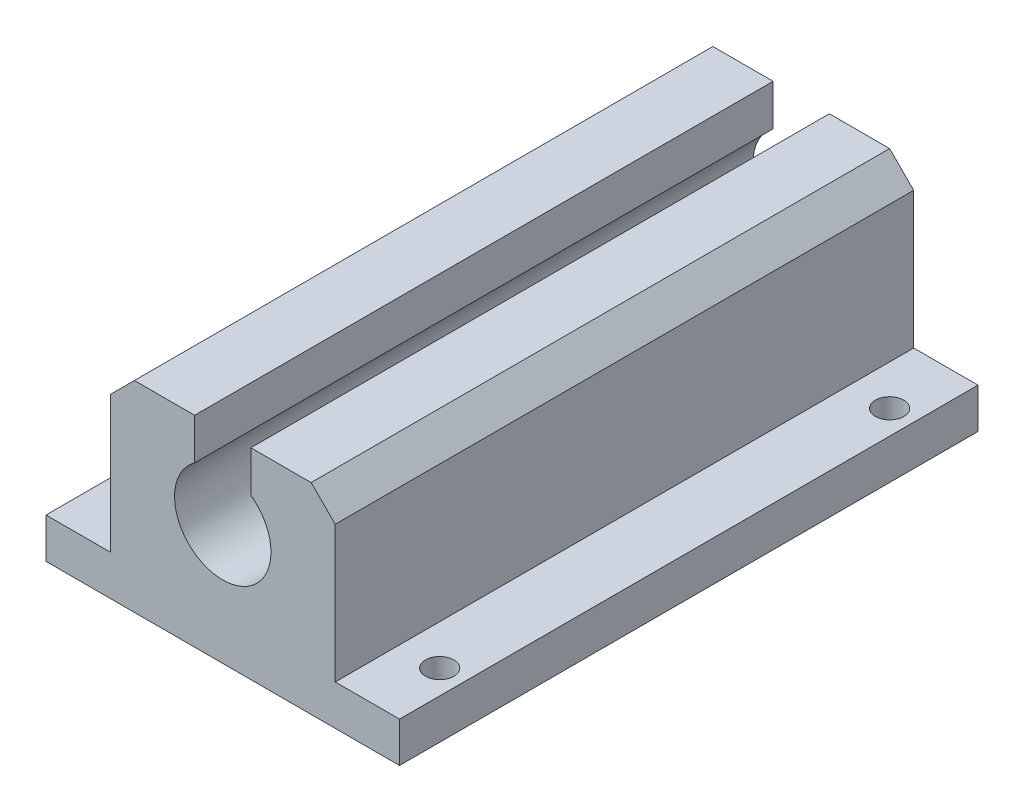
ISO-10303-21;
HEADER;
FILE_DESCRIPTION(('STEP AP214'),'2;1');
FILE_NAME('part.step','',(''),(''),'','','');
FILE_SCHEMA(('AUTOMOTIVE_DESIGN { 1 0 10303 214 1 1 1 1 }'));
ENDSEC;
DATA;
#1=APPLICATION_CONTEXT('core data for automotive mechanical design processes');
#2=APPLICATION_PROTOCOL_DEFINITION('international standard','automotive_design',2000,#1);
#3=PRODUCT_CONTEXT('',#1,'mechanical');
#4=PRODUCT('Part','Part','',(#3));
#5=PRODUCT_RELATED_PRODUCT_CATEGORY('part','',(#4));
#6=PRODUCT_DEFINITION_FORMATION('','',#4);
#7=PRODUCT_DEFINITION_CONTEXT('part definition',#1,'design');
#8=PRODUCT_DEFINITION('design','',#6,#7);
#9=PRODUCT_DEFINITION_SHAPE('','',#8);
#10=(LENGTH_UNIT() NAMED_UNIT(*) SI_UNIT(.MILLI.,.METRE.));
#11=(NAMED_UNIT(*) PLANE_ANGLE_UNIT() SI_UNIT($,.RADIAN.));
#12=(NAMED_UNIT(*) SI_UNIT($,.STERADIAN.) SOLID_ANGLE_UNIT());
#13=UNCERTAINTY_MEASURE_WITH_UNIT(LENGTH_MEASURE(1.E-05),#10,'distance_accuracy_value','');
#14=(GEOMETRIC_REPRESENTATION_CONTEXT(3) GLOBAL_UNCERTAINTY_ASSIGNED_CONTEXT((#13)) GLOBAL_UNIT_ASSIGNED_CONTEXT((#10,
#11,#12)) REPRESENTATION_CONTEXT('',''));
#15=CARTESIAN_POINT('',(0.,0.,0.));
#16=DIRECTION('',(0.,0.,1.));
#17=DIRECTION('',(1.,0.,0.));
#18=AXIS2_PLACEMENT_3D('',#15,#16,#17);
#19=CARTESIAN_POINT('',(34.925,-23.8125,57.15));
#20=DIRECTION('',(0.,1.,0.));
#21=DIRECTION('',(0.,0.,1.));
#22=AXIS2_PLACEMENT_3D('',#19,#20,#21);
#23=PLANE('',#22);
#24=CARTESIAN_POINT('',(-30.1625,-23.8125,-44.45));
#25=DIRECTION('',(0.,-1.,0.));
#26=DIRECTION('',(0.,0.,-1.));
#27=AXIS2_PLACEMENT_3D('',#24,#25,#26);
#28=CIRCLE('',#27,2.8067);
#29=CARTESIAN_POINT('',(-30.1625,-23.8125,-47.2567));
#30=VERTEX_POINT('',#29);
#31=EDGE_CURVE('E305',#30,#30,#28,.T.);
#32=ORIENTED_EDGE('',*,*,#31,.F.);
#33=EDGE_LOOP('',(#32));
#34=FACE_BOUND('',#33,.T.);
#35=CARTESIAN_POINT('',(30.1625,-23.8125,-44.45));
#36=DIRECTION('',(0.,-1.,0.));
#37=DIRECTION('',(0.,0.,-1.));
#38=AXIS2_PLACEMENT_3D('',#35,#36,#37);
#39=CIRCLE('',#38,2.8067);
#40=CARTESIAN_POINT('',(30.1625,-23.8125,-47.2567));
#41=VERTEX_POINT('',#40);
#42=EDGE_CURVE('E299',#41,#41,#39,.T.);
#43=ORIENTED_EDGE('',*,*,#42,.F.);
#44=EDGE_LOOP('',(#43));
#45=FACE_BOUND('',#44,.T.);
#46=DIRECTION('',(1.,0.,0.));
#47=VECTOR('',#46,1.);
#48=CARTESIAN_POINT('',(34.925,-23.8125,-57.15));
#49=LINE('',#48,#47);
#50=CARTESIAN_POINT('',(-34.925,-23.8125,-57.15));
#51=VERTEX_POINT('',#50);
#52=CARTESIAN_POINT('',(34.925,-23.8125,-57.15));
#53=VERTEX_POINT('',#52);
#54=EDGE_CURVE('E189',#51,#53,#49,.T.);
#55=ORIENTED_EDGE('',*,*,#54,.T.);
#56=DIRECTION('',(0.,0.,-1.));
#57=VECTOR('',#56,1.);
#58=CARTESIAN_POINT('',(34.925,-23.8125,57.15));
#59=LINE('',#58,#57);
#60=CARTESIAN_POINT('',(34.925,-23.8125,57.15));
#61=VERTEX_POINT('',#60);
#62=EDGE_CURVE('E225',#61,#53,#59,.T.);
#63=ORIENTED_EDGE('',*,*,#62,.F.);
#64=DIRECTION('',(1.,0.,0.));
#65=VECTOR('',#64,1.);
#66=CARTESIAN_POINT('',(34.925,-23.8125,57.15));
#67=LINE('',#66,#65);
#68=CARTESIAN_POINT('',(-34.925,-23.8125,57.15));
#69=VERTEX_POINT('',#68);
#70=EDGE_CURVE('E213',#69,#61,#67,.T.);
#71=ORIENTED_EDGE('',*,*,#70,.F.);
#72=DIRECTION('',(0.,0.,-1.));
#73=VECTOR('',#72,1.);
#74=CARTESIAN_POINT('',(-34.925,-23.8125,57.15));
#75=LINE('',#74,#73);
#76=EDGE_CURVE('E228',#69,#51,#75,.T.);
#77=ORIENTED_EDGE('',*,*,#76,.T.);
#78=EDGE_LOOP('',(#55,#63,#71,#77));
#79=FACE_BOUND('',#78,.T.);
#80=CARTESIAN_POINT('',(30.1625,-23.8125,44.45));
#81=DIRECTION('',(0.,-1.,0.));
#82=DIRECTION('',(0.,0.,-1.));
#83=AXIS2_PLACEMENT_3D('',#80,#81,#82);
#84=CIRCLE('',#83,2.8067);
#85=CARTESIAN_POINT('',(30.1625,-23.8125,41.6433));
#86=VERTEX_POINT('',#85);
#87=EDGE_CURVE('E285',#86,#86,#84,.T.);
#88=ORIENTED_EDGE('',*,*,#87,.F.);
#89=EDGE_LOOP('',(#88));
#90=FACE_BOUND('',#89,.T.);
#91=CARTESIAN_POINT('',(-30.1625,-23.8125,44.45));
#92=DIRECTION('',(0.,-1.,0.));
#93=DIRECTION('',(0.,0.,-1.));
#94=AXIS2_PLACEMENT_3D('',#91,#92,#93);
#95=CIRCLE('',#94,2.8067);
#96=CARTESIAN_POINT('',(-30.1625,-23.8125,41.6433));
#97=VERTEX_POINT('',#96);
#98=EDGE_CURVE('E293',#97,#97,#95,.T.);
#99=ORIENTED_EDGE('',*,*,#98,.F.);
#100=EDGE_LOOP('',(#99));
#101=FACE_BOUND('',#100,.T.);
#102=ADVANCED_FACE('F48',(#34,#45,#79,#90,#101),#23,.F.);
#103=CARTESIAN_POINT('',(22.225,15.875,57.15));
#104=DIRECTION('',(-1.,0.,0.));
#105=DIRECTION('',(0.,0.,1.));
#106=AXIS2_PLACEMENT_3D('',#103,#104,#105);
#107=PLANE('',#106);
#108=DIRECTION('',(0.,1.,0.));
#109=VECTOR('',#108,1.);
#110=CARTESIAN_POINT('',(22.225,15.875,-57.15));
#111=LINE('',#110,#109);
#112=CARTESIAN_POINT('',(22.225,-15.875,-57.15));
#113=VERTEX_POINT('',#112);
#114=CARTESIAN_POINT('',(22.225,11.1125,-57.15));
#115=VERTEX_POINT('',#114);
#116=EDGE_CURVE('E159',#113,#115,#111,.T.);
#117=ORIENTED_EDGE('',*,*,#116,.T.);
#118=DIRECTION('',(0.,0.,1.));
#119=VECTOR('',#118,1.);
#120=CARTESIAN_POINT('',(22.225,11.1125,57.15));
#121=LINE('',#120,#119);
#122=CARTESIAN_POINT('',(22.225,11.1125,57.15));
#123=VERTEX_POINT('',#122);
#124=EDGE_CURVE('E13',#115,#123,#121,.T.);
#125=ORIENTED_EDGE('',*,*,#124,.T.);
#126=DIRECTION('',(0.,1.,0.));
#127=VECTOR('',#126,1.);
#128=CARTESIAN_POINT('',(22.225,15.875,57.15));
#129=LINE('',#128,#127);
#130=CARTESIAN_POINT('',(22.225,-15.875,57.15));
#131=VERTEX_POINT('',#130);
#132=EDGE_CURVE('E195',#131,#123,#129,.T.);
#133=ORIENTED_EDGE('',*,*,#132,.F.);
#134=DIRECTION('',(0.,0.,-1.));
#135=VECTOR('',#134,1.);
#136=CARTESIAN_POINT('',(22.225,-15.875,57.15));
#137=LINE('',#136,#135);
#138=EDGE_CURVE('E219',#131,#113,#137,.T.);
#139=ORIENTED_EDGE('',*,*,#138,.T.);
#140=EDGE_LOOP('',(#117,#125,#133,#139));
#141=FACE_BOUND('',#140,.T.);
#142=ADVANCED_FACE('F50',(#141),#107,.F.);
#143=CARTESIAN_POINT('',(22.225,15.875,57.15));
#144=DIRECTION('',(0.,-1.,0.));
#145=DIRECTION('',(0.,0.,-1.));
#146=AXIS2_PLACEMENT_3D('',#143,#144,#145);
#147=PLANE('',#146);
#148=DIRECTION('',(-1.,0.,0.));
#149=VECTOR('',#148,1.);
#150=CARTESIAN_POINT('',(22.225,15.875,57.15));
#151=LINE('',#150,#149);
#152=CARTESIAN_POINT('',(17.4625,15.875,57.15));
#153=VERTEX_POINT('',#152);
#154=CARTESIAN_POINT('',(5.55625,15.875,57.15));
#155=VERTEX_POINT('',#154);
#156=EDGE_CURVE('E197',#153,#155,#151,.T.);
#157=ORIENTED_EDGE('',*,*,#156,.F.);
#158=DIRECTION('',(0.,0.,-1.));
#159=VECTOR('',#158,1.);
#160=CARTESIAN_POINT('',(17.4625,15.875,57.15));
#161=LINE('',#160,#159);
#162=CARTESIAN_POINT('',(17.4625,15.875,-57.15));
#163=VERTEX_POINT('',#162);
#164=EDGE_CURVE('E56',#153,#163,#161,.T.);
#165=ORIENTED_EDGE('',*,*,#164,.T.);
#166=DIRECTION('',(-1.,0.,0.));
#167=VECTOR('',#166,1.);
#168=CARTESIAN_POINT('',(22.225,15.875,-57.15));
#169=LINE('',#168,#167);
#170=CARTESIAN_POINT('',(5.55625,15.875,-57.15));
#171=VERTEX_POINT('',#170);
#172=EDGE_CURVE('E150',#163,#171,#169,.T.);
#173=ORIENTED_EDGE('',*,*,#172,.T.);
#174=DIRECTION('',(0.,0.,-1.));
#175=VECTOR('',#174,1.);
#176=CARTESIAN_POINT('',(5.55625,15.875,57.15));
#177=LINE('',#176,#175);
#178=EDGE_CURVE('E153',#155,#171,#177,.T.);
#179=ORIENTED_EDGE('',*,*,#178,.F.);
#180=EDGE_LOOP('',(#157,#165,#173,#179));
#181=FACE_BOUND('',#180,.T.);
#182=ADVANCED_FACE('F152',(#181),#147,.F.);
#183=CARTESIAN_POINT('',(5.55625,15.875,57.15));
#184=DIRECTION('',(1.,0.,0.));
#185=DIRECTION('',(0.,0.,-1.));
#186=AXIS2_PLACEMENT_3D('',#183,#184,#185);
#187=PLANE('',#186);
#188=DIRECTION('',(0.,-1.,0.));
#189=VECTOR('',#188,1.);
#190=CARTESIAN_POINT('',(5.55625,15.875,-57.15));
#191=LINE('',#190,#189);
#192=CARTESIAN_POINT('',(5.55625,7.73651801119212,-57.15));
#193=VERTEX_POINT('',#192);
#194=EDGE_CURVE('E158',#171,#193,#191,.T.);
#195=ORIENTED_EDGE('',*,*,#194,.T.);
#196=DIRECTION('',(0.,0.,-1.));
#197=VECTOR('',#196,1.);
#198=CARTESIAN_POINT('',(5.55625,7.73651801119212,57.15));
#199=LINE('',#198,#197);
#200=CARTESIAN_POINT('',(5.55625,7.73651801119212,57.15));
#201=VERTEX_POINT('',#200);
#202=EDGE_CURVE('E167',#201,#193,#199,.T.);
#203=ORIENTED_EDGE('',*,*,#202,.F.);
#204=DIRECTION('',(0.,-1.,0.));
#205=VECTOR('',#204,1.);
#206=CARTESIAN_POINT('',(5.55625,15.875,57.15));
#207=LINE('',#206,#205);
#208=EDGE_CURVE('E165',#155,#201,#207,.T.);
#209=ORIENTED_EDGE('',*,*,#208,.F.);
#210=ORIENTED_EDGE('',*,*,#178,.T.);
#211=EDGE_LOOP('',(#195,#203,#209,#210));
#212=FACE_BOUND('',#211,.T.);
#213=ADVANCED_FACE('F162',(#212),#187,.F.);
#214=CARTESIAN_POINT('',(0.,0.,57.15));
#215=DIRECTION('',(0.,0.,-1.));
#216=DIRECTION('',(-1.,0.,0.));
#217=AXIS2_PLACEMENT_3D('',#214,#215,#216);
#218=CYLINDRICAL_SURFACE('',#217,9.525);
#219=CARTESIAN_POINT('',(0.,0.,-57.15));
#220=DIRECTION('',(0.,0.,-1.));
#221=DIRECTION('',(1.,0.,0.));
#222=AXIS2_PLACEMENT_3D('',#219,#220,#221);
#223=CIRCLE('',#222,9.525);
#224=CARTESIAN_POINT('',(-5.55625,7.73651801119212,-57.15));
#225=VERTEX_POINT('',#224);
#226=EDGE_CURVE('E173',#193,#225,#223,.T.);
#227=ORIENTED_EDGE('',*,*,#226,.T.);
#228=DIRECTION('',(0.,0.,-1.));
#229=VECTOR('',#228,1.);
#230=CARTESIAN_POINT('',(-5.55625,7.73651801119212,57.15));
#231=LINE('',#230,#229);
#232=CARTESIAN_POINT('',(-5.55625,7.73651801119212,57.15));
#233=VERTEX_POINT('',#232);
#234=EDGE_CURVE('E240',#233,#225,#231,.T.);
#235=ORIENTED_EDGE('',*,*,#234,.F.);
#236=CARTESIAN_POINT('',(0.,0.,57.15));
#237=DIRECTION('',(0.,0.,-1.));
#238=DIRECTION('',(1.,0.,0.));
#239=AXIS2_PLACEMENT_3D('',#236,#237,#238);
#240=CIRCLE('',#239,9.525);
#241=EDGE_CURVE('E200',#201,#233,#240,.T.);
#242=ORIENTED_EDGE('',*,*,#241,.F.);
#243=ORIENTED_EDGE('',*,*,#202,.T.);
#244=EDGE_LOOP('',(#227,#235,#242,#243));
#245=FACE_BOUND('',#244,.T.);
#246=ADVANCED_FACE('F277',(#245),#218,.F.);
#247=CARTESIAN_POINT('',(-5.55625,15.875,57.15));
#248=DIRECTION('',(-1.,0.,0.));
#249=DIRECTION('',(0.,0.,1.));
#250=AXIS2_PLACEMENT_3D('',#247,#248,#249);
#251=PLANE('',#250);
#252=DIRECTION('',(0.,1.,0.));
#253=VECTOR('',#252,1.);
#254=CARTESIAN_POINT('',(-5.55625,15.875,-57.15));
#255=LINE('',#254,#253);
#256=CARTESIAN_POINT('',(-5.55625,15.875,-57.15));
#257=VERTEX_POINT('',#256);
#258=EDGE_CURVE('E175',#225,#257,#255,.T.);
#259=ORIENTED_EDGE('',*,*,#258,.T.);
#260=DIRECTION('',(0.,0.,-1.));
#261=VECTOR('',#260,1.);
#262=CARTESIAN_POINT('',(-5.55625,15.875,57.15));
#263=LINE('',#262,#261);
#264=CARTESIAN_POINT('',(-5.55625,15.875,57.15));
#265=VERTEX_POINT('',#264);
#266=EDGE_CURVE('E237',#265,#257,#263,.T.);
#267=ORIENTED_EDGE('',*,*,#266,.F.);
#268=DIRECTION('',(0.,1.,0.));
#269=VECTOR('',#268,1.);
#270=CARTESIAN_POINT('',(-5.55625,15.875,57.15));
#271=LINE('',#270,#269);
#272=EDGE_CURVE('E202',#233,#265,#271,.T.);
#273=ORIENTED_EDGE('',*,*,#272,.F.);
#274=ORIENTED_EDGE('',*,*,#234,.T.);
#275=EDGE_LOOP('',(#259,#267,#273,#274));
#276=FACE_BOUND('',#275,.T.);
#277=ADVANCED_FACE('F273',(#276),#251,.F.);
#278=CARTESIAN_POINT('',(-22.225,15.875,57.15));
#279=DIRECTION('',(0.,-1.,0.));
#280=DIRECTION('',(0.,0.,-1.));
#281=AXIS2_PLACEMENT_3D('',#278,#279,#280);
#282=PLANE('',#281);
#283=DIRECTION('',(-1.,0.,0.));
#284=VECTOR('',#283,1.);
#285=CARTESIAN_POINT('',(-22.225,15.875,-57.15));
#286=LINE('',#285,#284);
#287=CARTESIAN_POINT('',(-17.4625,15.875,-57.15));
#288=VERTEX_POINT('',#287);
#289=EDGE_CURVE('E180',#257,#288,#286,.T.);
#290=ORIENTED_EDGE('',*,*,#289,.T.);
#291=DIRECTION('',(0.,0.,1.));
#292=VECTOR('',#291,1.);
#293=CARTESIAN_POINT('',(-17.4625,15.875,57.15));
#294=LINE('',#293,#292);
#295=CARTESIAN_POINT('',(-17.4625,15.875,57.15));
#296=VERTEX_POINT('',#295);
#297=EDGE_CURVE('E250',#288,#296,#294,.T.);
#298=ORIENTED_EDGE('',*,*,#297,.T.);
#299=DIRECTION('',(-1.,0.,0.));
#300=VECTOR('',#299,1.);
#301=CARTESIAN_POINT('',(-22.225,15.875,57.15));
#302=LINE('',#301,#300);
#303=EDGE_CURVE('E204',#265,#296,#302,.T.);
#304=ORIENTED_EDGE('',*,*,#303,.F.);
#305=ORIENTED_EDGE('',*,*,#266,.T.);
#306=EDGE_LOOP('',(#290,#298,#304,#305));
#307=FACE_BOUND('',#306,.T.);
#308=ADVANCED_FACE('F269',(#307),#282,.F.);
#309=CARTESIAN_POINT('',(-22.225,-15.875,57.15));
#310=DIRECTION('',(1.,0.,0.));
#311=DIRECTION('',(0.,0.,-1.));
#312=AXIS2_PLACEMENT_3D('',#309,#310,#311);
#313=PLANE('',#312);
#314=DIRECTION('',(0.,-1.,0.));
#315=VECTOR('',#314,1.);
#316=CARTESIAN_POINT('',(-22.225,-15.875,57.15));
#317=LINE('',#316,#315);
#318=CARTESIAN_POINT('',(-22.225,11.1125,57.15));
#319=VERTEX_POINT('',#318);
#320=CARTESIAN_POINT('',(-22.225,-15.875,57.15));
#321=VERTEX_POINT('',#320);
#322=EDGE_CURVE('E207',#319,#321,#317,.T.);
#323=ORIENTED_EDGE('',*,*,#322,.F.);
#324=DIRECTION('',(0.,0.,-1.));
#325=VECTOR('',#324,1.);
#326=CARTESIAN_POINT('',(-22.225,11.1125,57.15));
#327=LINE('',#326,#325);
#328=CARTESIAN_POINT('',(-22.225,11.1125,-57.15));
#329=VERTEX_POINT('',#328);
#330=EDGE_CURVE('E166',#319,#329,#327,.T.);
#331=ORIENTED_EDGE('',*,*,#330,.T.);
#332=DIRECTION('',(0.,-1.,0.));
#333=VECTOR('',#332,1.);
#334=CARTESIAN_POINT('',(-22.225,-15.875,-57.15));
#335=LINE('',#334,#333);
#336=CARTESIAN_POINT('',(-22.225,-15.875,-57.15));
#337=VERTEX_POINT('',#336);
#338=EDGE_CURVE('E183',#329,#337,#335,.T.);
#339=ORIENTED_EDGE('',*,*,#338,.T.);
#340=DIRECTION('',(0.,0.,-1.));
#341=VECTOR('',#340,1.);
#342=CARTESIAN_POINT('',(-22.225,-15.875,57.15));
#343=LINE('',#342,#341);
#344=EDGE_CURVE('E234',#321,#337,#343,.T.);
#345=ORIENTED_EDGE('',*,*,#344,.F.);
#346=EDGE_LOOP('',(#323,#331,#339,#345));
#347=FACE_BOUND('',#346,.T.);
#348=ADVANCED_FACE('F263',(#347),#313,.F.);
#349=CARTESIAN_POINT('',(-34.925,-15.875,57.15));
#350=DIRECTION('',(0.,-1.,0.));
#351=DIRECTION('',(0.,0.,-1.));
#352=AXIS2_PLACEMENT_3D('',#349,#350,#351);
#353=PLANE('',#352);
#354=CARTESIAN_POINT('',(-30.1625,-15.875,-44.45));
#355=DIRECTION('',(0.,-1.,0.));
#356=DIRECTION('',(0.,0.,-1.));
#357=AXIS2_PLACEMENT_3D('',#354,#355,#356);
#358=CIRCLE('',#357,2.8067);
#359=CARTESIAN_POINT('',(-30.1625,-15.875,-47.2567));
#360=VERTEX_POINT('',#359);
#361=EDGE_CURVE('E302',#360,#360,#358,.T.);
#362=ORIENTED_EDGE('',*,*,#361,.T.);
#363=EDGE_LOOP('',(#362));
#364=FACE_BOUND('',#363,.T.);
#365=CARTESIAN_POINT('',(-30.1625,-15.875,44.45));
#366=DIRECTION('',(0.,-1.,0.));
#367=DIRECTION('',(0.,0.,-1.));
#368=AXIS2_PLACEMENT_3D('',#365,#366,#367);
#369=CIRCLE('',#368,2.8067);
#370=CARTESIAN_POINT('',(-30.1625,-15.875,41.6433));
#371=VERTEX_POINT('',#370);
#372=EDGE_CURVE('E290',#371,#371,#369,.T.);
#373=ORIENTED_EDGE('',*,*,#372,.T.);
#374=EDGE_LOOP('',(#373));
#375=FACE_BOUND('',#374,.T.);
#376=DIRECTION('',(-1.,0.,0.));
#377=VECTOR('',#376,1.);
#378=CARTESIAN_POINT('',(-34.925,-15.875,-57.15));
#379=LINE('',#378,#377);
#380=CARTESIAN_POINT('',(-34.925,-15.875,-57.15));
#381=VERTEX_POINT('',#380);
#382=EDGE_CURVE('E185',#337,#381,#379,.T.);
#383=ORIENTED_EDGE('',*,*,#382,.T.);
#384=DIRECTION('',(0.,0.,-1.));
#385=VECTOR('',#384,1.);
#386=CARTESIAN_POINT('',(-34.925,-15.875,57.15));
#387=LINE('',#386,#385);
#388=CARTESIAN_POINT('',(-34.925,-15.875,57.15));
#389=VERTEX_POINT('',#388);
#390=EDGE_CURVE('E231',#389,#381,#387,.T.);
#391=ORIENTED_EDGE('',*,*,#390,.F.);
#392=DIRECTION('',(-1.,0.,0.));
#393=VECTOR('',#392,1.);
#394=CARTESIAN_POINT('',(-34.925,-15.875,57.15));
#395=LINE('',#394,#393);
#396=EDGE_CURVE('E209',#321,#389,#395,.T.);
#397=ORIENTED_EDGE('',*,*,#396,.F.);
#398=ORIENTED_EDGE('',*,*,#344,.T.);
#399=EDGE_LOOP('',(#383,#391,#397,#398));
#400=FACE_BOUND('',#399,.T.);
#401=ADVANCED_FACE('F355',(#364,#375,#400),#353,.F.);
#402=CARTESIAN_POINT('',(-34.925,-23.8125,57.15));
#403=DIRECTION('',(1.,0.,0.));
#404=DIRECTION('',(0.,0.,-1.));
#405=AXIS2_PLACEMENT_3D('',#402,#403,#404);
#406=PLANE('',#405);
#407=DIRECTION('',(0.,-1.,0.));
#408=VECTOR('',#407,1.);
#409=CARTESIAN_POINT('',(-34.925,-23.8125,-57.15));
#410=LINE('',#409,#408);
#411=EDGE_CURVE('E187',#381,#51,#410,.T.);
#412=ORIENTED_EDGE('',*,*,#411,.T.);
#413=ORIENTED_EDGE('',*,*,#76,.F.);
#414=DIRECTION('',(0.,-1.,0.));
#415=VECTOR('',#414,1.);
#416=CARTESIAN_POINT('',(-34.925,-23.8125,57.15));
#417=LINE('',#416,#415);
#418=EDGE_CURVE('E211',#389,#69,#417,.T.);
#419=ORIENTED_EDGE('',*,*,#418,.F.);
#420=ORIENTED_EDGE('',*,*,#390,.T.);
#421=EDGE_LOOP('',(#412,#413,#419,#420));
#422=FACE_BOUND('',#421,.T.);
#423=ADVANCED_FACE('F350',(#422),#406,.F.);
#424=CARTESIAN_POINT('',(34.925,-15.875,57.15));
#425=DIRECTION('',(-1.,0.,0.));
#426=DIRECTION('',(0.,0.,1.));
#427=AXIS2_PLACEMENT_3D('',#424,#425,#426);
#428=PLANE('',#427);
#429=DIRECTION('',(0.,1.,0.));
#430=VECTOR('',#429,1.);
#431=CARTESIAN_POINT('',(34.925,-15.875,-57.15));
#432=LINE('',#431,#430);
#433=CARTESIAN_POINT('',(34.925,-15.875,-57.15));
#434=VERTEX_POINT('',#433);
#435=EDGE_CURVE('E191',#53,#434,#432,.T.);
#436=ORIENTED_EDGE('',*,*,#435,.T.);
#437=DIRECTION('',(0.,0.,-1.));
#438=VECTOR('',#437,1.);
#439=CARTESIAN_POINT('',(34.925,-15.875,57.15));
#440=LINE('',#439,#438);
#441=CARTESIAN_POINT('',(34.925,-15.875,57.15));
#442=VERTEX_POINT('',#441);
#443=EDGE_CURVE('E222',#442,#434,#440,.T.);
#444=ORIENTED_EDGE('',*,*,#443,.F.);
#445=DIRECTION('',(0.,1.,0.));
#446=VECTOR('',#445,1.);
#447=CARTESIAN_POINT('',(34.925,-15.875,57.15));
#448=LINE('',#447,#446);
#449=EDGE_CURVE('E215',#61,#442,#448,.T.);
#450=ORIENTED_EDGE('',*,*,#449,.F.);
#451=ORIENTED_EDGE('',*,*,#62,.T.);
#452=EDGE_LOOP('',(#436,#444,#450,#451));
#453=FACE_BOUND('',#452,.T.);
#454=ADVANCED_FACE('F347',(#453),#428,.F.);
#455=CARTESIAN_POINT('',(22.225,-15.875,57.15));
#456=DIRECTION('',(0.,-1.,0.));
#457=DIRECTION('',(0.,0.,-1.));
#458=AXIS2_PLACEMENT_3D('',#455,#456,#457);
#459=PLANE('',#458);
#460=CARTESIAN_POINT('',(30.1625,-15.875,-44.45));
#461=DIRECTION('',(0.,-1.,0.));
#462=DIRECTION('',(0.,0.,-1.));
#463=AXIS2_PLACEMENT_3D('',#460,#461,#462);
#464=CIRCLE('',#463,2.8067);
#465=CARTESIAN_POINT('',(30.1625,-15.875,-47.2567));
#466=VERTEX_POINT('',#465);
#467=EDGE_CURVE('E296',#466,#466,#464,.T.);
#468=ORIENTED_EDGE('',*,*,#467,.T.);
#469=EDGE_LOOP('',(#468));
#470=FACE_BOUND('',#469,.T.);
#471=CARTESIAN_POINT('',(30.1625,-15.875,44.45));
#472=DIRECTION('',(0.,-1.,0.));
#473=DIRECTION('',(0.,0.,-1.));
#474=AXIS2_PLACEMENT_3D('',#471,#472,#473);
#475=CIRCLE('',#474,2.8067);
#476=CARTESIAN_POINT('',(30.1625,-15.875,41.6433));
#477=VERTEX_POINT('',#476);
#478=EDGE_CURVE('E283',#477,#477,#475,.T.);
#479=ORIENTED_EDGE('',*,*,#478,.T.);
#480=EDGE_LOOP('',(#479));
#481=FACE_BOUND('',#480,.T.);
#482=DIRECTION('',(-1.,0.,0.));
#483=VECTOR('',#482,1.);
#484=CARTESIAN_POINT('',(22.225,-15.875,-57.15));
#485=LINE('',#484,#483);
#486=EDGE_CURVE('E193',#434,#113,#485,.T.);
#487=ORIENTED_EDGE('',*,*,#486,.T.);
#488=ORIENTED_EDGE('',*,*,#138,.F.);
#489=DIRECTION('',(-1.,0.,0.));
#490=VECTOR('',#489,1.);
#491=CARTESIAN_POINT('',(22.225,-15.875,57.15));
#492=LINE('',#491,#490);
#493=EDGE_CURVE('E217',#442,#131,#492,.T.);
#494=ORIENTED_EDGE('',*,*,#493,.F.);
#495=ORIENTED_EDGE('',*,*,#443,.T.);
#496=EDGE_LOOP('',(#487,#488,#494,#495));
#497=FACE_BOUND('',#496,.T.);
#498=ADVANCED_FACE('F344',(#470,#481,#497),#459,.F.);
#499=CARTESIAN_POINT('',(0.,0.,57.15));
#500=DIRECTION('',(0.,0.,1.));
#501=DIRECTION('',(1.,0.,0.));
#502=AXIS2_PLACEMENT_3D('',#499,#500,#501);
#503=PLANE('',#502);
#504=ORIENTED_EDGE('',*,*,#303,.T.);
#505=DIRECTION('',(0.707106781186549,0.707106781186547,0.));
#506=VECTOR('',#505,1.);
#507=CARTESIAN_POINT('',(-16.66875,16.66875,57.15));
#508=LINE('',#507,#506);
#509=EDGE_CURVE('E253',#296,#319,#508,.F.);
#510=ORIENTED_EDGE('',*,*,#509,.T.);
#511=ORIENTED_EDGE('',*,*,#322,.T.);
#512=ORIENTED_EDGE('',*,*,#396,.T.);
#513=ORIENTED_EDGE('',*,*,#418,.T.);
#514=ORIENTED_EDGE('',*,*,#70,.T.);
#515=ORIENTED_EDGE('',*,*,#449,.T.);
#516=ORIENTED_EDGE('',*,*,#493,.T.);
#517=ORIENTED_EDGE('',*,*,#132,.T.);
#518=DIRECTION('',(0.707106781186547,-0.707106781186549,0.));
#519=VECTOR('',#518,1.);
#520=CARTESIAN_POINT('',(16.66875,16.66875,57.15));
#521=LINE('',#520,#519);
#522=EDGE_CURVE('E63',#123,#153,#521,.F.);
#523=ORIENTED_EDGE('',*,*,#522,.T.);
#524=ORIENTED_EDGE('',*,*,#156,.T.);
#525=ORIENTED_EDGE('',*,*,#208,.T.);
#526=ORIENTED_EDGE('',*,*,#241,.T.);
#527=ORIENTED_EDGE('',*,*,#272,.T.);
#528=EDGE_LOOP('',(#504,#510,#511,#512,#513,#514,#515,#516,#517,#523,#524,#525,#526,#527));
#529=FACE_BOUND('',#528,.T.);
#530=ADVANCED_FACE('F256',(#529),#503,.T.);
#531=CARTESIAN_POINT('',(0.,0.,-57.15));
#532=DIRECTION('',(0.,0.,1.));
#533=DIRECTION('',(1.,0.,0.));
#534=AXIS2_PLACEMENT_3D('',#531,#532,#533);
#535=PLANE('',#534);
#536=ORIENTED_EDGE('',*,*,#338,.F.);
#537=DIRECTION('',(-0.707106781186549,-0.707106781186547,0.));
#538=VECTOR('',#537,1.);
#539=CARTESIAN_POINT('',(-22.225,11.1125,-57.15));
#540=LINE('',#539,#538);
#541=EDGE_CURVE('E248',#329,#288,#540,.F.);
#542=ORIENTED_EDGE('',*,*,#541,.T.);
#543=ORIENTED_EDGE('',*,*,#289,.F.);
#544=ORIENTED_EDGE('',*,*,#258,.F.);
#545=ORIENTED_EDGE('',*,*,#226,.F.);
#546=ORIENTED_EDGE('',*,*,#194,.F.);
#547=ORIENTED_EDGE('',*,*,#172,.F.);
#548=DIRECTION('',(-0.707106781186547,0.707106781186549,0.));
#549=VECTOR('',#548,1.);
#550=CARTESIAN_POINT('',(17.4625,15.875,-57.15));
#551=LINE('',#550,#549);
#552=EDGE_CURVE('E246',#163,#115,#551,.F.);
#553=ORIENTED_EDGE('',*,*,#552,.T.);
#554=ORIENTED_EDGE('',*,*,#116,.F.);
#555=ORIENTED_EDGE('',*,*,#486,.F.);
#556=ORIENTED_EDGE('',*,*,#435,.F.);
#557=ORIENTED_EDGE('',*,*,#54,.F.);
#558=ORIENTED_EDGE('',*,*,#411,.F.);
#559=ORIENTED_EDGE('',*,*,#382,.F.);
#560=EDGE_LOOP('',(#536,#542,#543,#544,#545,#546,#547,#553,#554,#555,#556,#557,#558,#559));
#561=FACE_BOUND('',#560,.T.);
#562=ADVANCED_FACE('F171',(#561),#535,.F.);
#563=CARTESIAN_POINT('',(30.1625,-23.8125,44.45));
#564=DIRECTION('',(0.,-1.,0.));
#565=DIRECTION('',(0.,0.,-1.));
#566=AXIS2_PLACEMENT_3D('',#563,#564,#565);
#567=CYLINDRICAL_SURFACE('',#566,2.8067);
#568=ORIENTED_EDGE('',*,*,#478,.F.);
#569=EDGE_LOOP('',(#568));
#570=FACE_BOUND('',#569,.T.);
#571=ORIENTED_EDGE('',*,*,#87,.T.);
#572=EDGE_LOOP('',(#571));
#573=FACE_BOUND('',#572,.T.);
#574=ADVANCED_FACE('F326',(#570,#573),#567,.F.);
#575=CARTESIAN_POINT('',(-30.1625,-23.8125,44.45));
#576=DIRECTION('',(0.,-1.,0.));
#577=DIRECTION('',(0.,0.,-1.));
#578=AXIS2_PLACEMENT_3D('',#575,#576,#577);
#579=CYLINDRICAL_SURFACE('',#578,2.8067);
#580=ORIENTED_EDGE('',*,*,#372,.F.);
#581=EDGE_LOOP('',(#580));
#582=FACE_BOUND('',#581,.T.);
#583=ORIENTED_EDGE('',*,*,#98,.T.);
#584=EDGE_LOOP('',(#583));
#585=FACE_BOUND('',#584,.T.);
#586=ADVANCED_FACE('F323',(#582,#585),#579,.F.);
#587=CARTESIAN_POINT('',(30.1625,-23.8125,-44.45));
#588=DIRECTION('',(0.,-1.,0.));
#589=DIRECTION('',(0.,0.,-1.));
#590=AXIS2_PLACEMENT_3D('',#587,#588,#589);
#591=CYLINDRICAL_SURFACE('',#590,2.8067);
#592=ORIENTED_EDGE('',*,*,#467,.F.);
#593=EDGE_LOOP('',(#592));
#594=FACE_BOUND('',#593,.T.);
#595=ORIENTED_EDGE('',*,*,#42,.T.);
#596=EDGE_LOOP('',(#595));
#597=FACE_BOUND('',#596,.T.);
#598=ADVANCED_FACE('F325',(#594,#597),#591,.F.);
#599=CARTESIAN_POINT('',(-30.1625,-23.8125,-44.45));
#600=DIRECTION('',(0.,-1.,0.));
#601=DIRECTION('',(0.,0.,-1.));
#602=AXIS2_PLACEMENT_3D('',#599,#600,#601);
#603=CYLINDRICAL_SURFACE('',#602,2.8067);
#604=ORIENTED_EDGE('',*,*,#361,.F.);
#605=EDGE_LOOP('',(#604));
#606=FACE_BOUND('',#605,.T.);
#607=ORIENTED_EDGE('',*,*,#31,.T.);
#608=EDGE_LOOP('',(#607));
#609=FACE_BOUND('',#608,.T.);
#610=ADVANCED_FACE('F309',(#606,#609),#603,.F.);
#611=CARTESIAN_POINT('',(-22.225,11.1125,57.15));
#612=DIRECTION('',(0.707106781186546,-0.707106781186548,0.));
#613=DIRECTION('',(0.707106781186549,0.707106781186547,0.));
#614=AXIS2_PLACEMENT_3D('',#611,#612,#613);
#615=PLANE('',#614);
#616=ORIENTED_EDGE('',*,*,#509,.F.);
#617=ORIENTED_EDGE('',*,*,#297,.F.);
#618=ORIENTED_EDGE('',*,*,#541,.F.);
#619=ORIENTED_EDGE('',*,*,#330,.F.);
#620=EDGE_LOOP('',(#616,#617,#618,#619));
#621=FACE_BOUND('',#620,.T.);
#622=ADVANCED_FACE('F265',(#621),#615,.F.);
#623=CARTESIAN_POINT('',(17.4625,15.875,57.15));
#624=DIRECTION('',(-0.707106781186548,-0.707106781186546,0.));
#625=DIRECTION('',(0.707106781186547,-0.707106781186549,0.));
#626=AXIS2_PLACEMENT_3D('',#623,#624,#625);
#627=PLANE('',#626);
#628=ORIENTED_EDGE('',*,*,#522,.F.);
#629=ORIENTED_EDGE('',*,*,#124,.F.);
#630=ORIENTED_EDGE('',*,*,#552,.F.);
#631=ORIENTED_EDGE('',*,*,#164,.F.);
#632=EDGE_LOOP('',(#628,#629,#630,#631));
#633=FACE_BOUND('',#632,.T.);
#634=ADVANCED_FACE('F279',(#633),#627,.F.);
#635=CLOSED_SHELL('',(#102,#142,#182,#213,#246,#277,#308,#348,#401,#423,#454,#498,#530,#562,
#574,#586,#598,#610,#622,#634));
#636=MANIFOLD_SOLID_BREP('B2',#635);
#637=ADVANCED_BREP_SHAPE_REPRESENTATION('',(#18,#636),#14);
#638=SHAPE_DEFINITION_REPRESENTATION(#9,#637);
ENDSEC;
END-ISO-10303-21;
